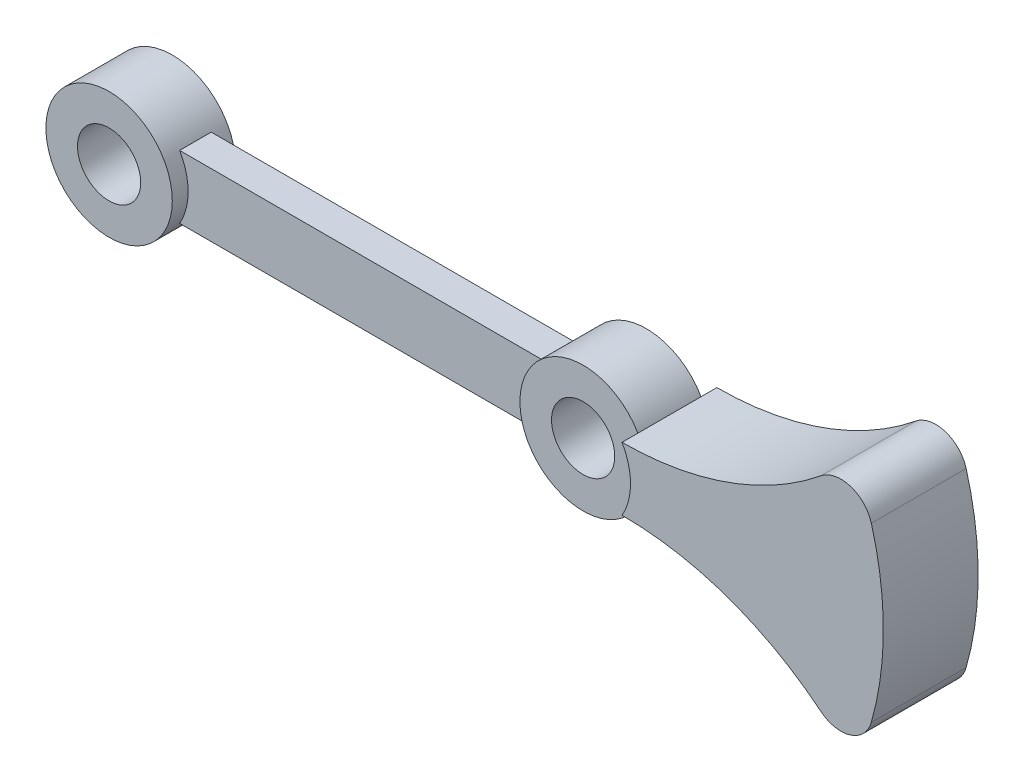
ISO-10303-21;
HEADER;
FILE_DESCRIPTION(('STEP AP214'),'2;1');
FILE_NAME('part.step','',(''),(''),'','','');
FILE_SCHEMA(('AUTOMOTIVE_DESIGN { 1 0 10303 214 1 1 1 1 }'));
ENDSEC;
DATA;
#1=APPLICATION_CONTEXT('core data for automotive mechanical design processes');
#2=APPLICATION_PROTOCOL_DEFINITION('international standard','automotive_design',2000,#1);
#3=PRODUCT_CONTEXT('',#1,'mechanical');
#4=PRODUCT('Part','Part','',(#3));
#5=PRODUCT_RELATED_PRODUCT_CATEGORY('part','',(#4));
#6=PRODUCT_DEFINITION_FORMATION('','',#4);
#7=PRODUCT_DEFINITION_CONTEXT('part definition',#1,'design');
#8=PRODUCT_DEFINITION('design','',#6,#7);
#9=PRODUCT_DEFINITION_SHAPE('','',#8);
#10=(LENGTH_UNIT() NAMED_UNIT(*) SI_UNIT(.MILLI.,.METRE.));
#11=(NAMED_UNIT(*) PLANE_ANGLE_UNIT() SI_UNIT($,.RADIAN.));
#12=(NAMED_UNIT(*) SI_UNIT($,.STERADIAN.) SOLID_ANGLE_UNIT());
#13=UNCERTAINTY_MEASURE_WITH_UNIT(LENGTH_MEASURE(1.E-05),#10,'distance_accuracy_value','');
#14=(GEOMETRIC_REPRESENTATION_CONTEXT(3) GLOBAL_UNCERTAINTY_ASSIGNED_CONTEXT((#13)) GLOBAL_UNIT_ASSIGNED_CONTEXT((#10,
#11,#12)) REPRESENTATION_CONTEXT('',''));
#15=CARTESIAN_POINT('',(0.,0.,0.));
#16=DIRECTION('',(0.,0.,1.));
#17=DIRECTION('',(1.,0.,0.));
#18=AXIS2_PLACEMENT_3D('',#15,#16,#17);
#19=CARTESIAN_POINT('',(45.,0.,-6.));
#20=DIRECTION('',(0.,0.,1.));
#21=DIRECTION('',(1.,0.,0.));
#22=AXIS2_PLACEMENT_3D('',#19,#20,#21);
#23=CYLINDRICAL_SURFACE('',#22,12.);
#24=DIRECTION('',(0.,0.,-1.));
#25=VECTOR('',#24,1.);
#26=CARTESIAN_POINT('',(34.6076951545867,6.,3.));
#27=LINE('',#26,#25);
#28=CARTESIAN_POINT('',(34.6076951545867,6.,3.));
#29=VERTEX_POINT('',#28);
#30=CARTESIAN_POINT('',(34.6076951545867,6.,-3.));
#31=VERTEX_POINT('',#30);
#32=EDGE_CURVE('E243',#29,#31,#27,.T.);
#33=ORIENTED_EDGE('',*,*,#32,.F.);
#34=CARTESIAN_POINT('',(45.,0.,3.));
#35=DIRECTION('',(0.,0.,-1.));
#36=DIRECTION('',(1.,0.,0.));
#37=AXIS2_PLACEMENT_3D('',#34,#35,#36);
#38=CIRCLE('',#37,12.);
#39=CARTESIAN_POINT('',(34.6076951545867,-6.,3.));
#40=VERTEX_POINT('',#39);
#41=EDGE_CURVE('E228',#40,#29,#38,.T.);
#42=ORIENTED_EDGE('',*,*,#41,.F.);
#43=DIRECTION('',(0.,0.,-1.));
#44=VECTOR('',#43,1.);
#45=CARTESIAN_POINT('',(34.6076951545867,-6.,3.));
#46=LINE('',#45,#44);
#47=CARTESIAN_POINT('',(34.6076951545867,-6.,-3.));
#48=VERTEX_POINT('',#47);
#49=EDGE_CURVE('E246',#40,#48,#46,.T.);
#50=ORIENTED_EDGE('',*,*,#49,.T.);
#51=CARTESIAN_POINT('',(45.,0.,-3.));
#52=DIRECTION('',(0.,0.,-1.));
#53=DIRECTION('',(1.,0.,0.));
#54=AXIS2_PLACEMENT_3D('',#51,#52,#53);
#55=CIRCLE('',#54,12.);
#56=EDGE_CURVE('E237',#48,#31,#55,.T.);
#57=ORIENTED_EDGE('',*,*,#56,.T.);
#58=EDGE_LOOP('',(#33,#42,#50,#57));
#59=FACE_BOUND('',#58,.T.);
#60=CARTESIAN_POINT('',(45.,0.,-6.));
#61=DIRECTION('',(0.,0.,1.));
#62=DIRECTION('',(1.,0.,0.));
#63=AXIS2_PLACEMENT_3D('',#60,#61,#62);
#64=CIRCLE('',#63,12.);
#65=CARTESIAN_POINT('',(55.3923048454132,6.00000000000001,-6.));
#66=VERTEX_POINT('',#65);
#67=CARTESIAN_POINT('',(55.3923048454132,-6.00000000000001,-6.));
#68=VERTEX_POINT('',#67);
#69=EDGE_CURVE('E217',#66,#68,#64,.T.);
#70=ORIENTED_EDGE('',*,*,#69,.T.);
#71=DIRECTION('',(0.,0.,-1.));
#72=VECTOR('',#71,1.);
#73=CARTESIAN_POINT('',(55.3923048454132,-6.00000000000001,9.));
#74=LINE('',#73,#72);
#75=CARTESIAN_POINT('',(55.3923048454132,-6.00000000000001,6.));
#76=VERTEX_POINT('',#75);
#77=EDGE_CURVE('E150',#76,#68,#74,.T.);
#78=ORIENTED_EDGE('',*,*,#77,.F.);
#79=CARTESIAN_POINT('',(45.,0.,6.));
#80=DIRECTION('',(0.,0.,1.));
#81=DIRECTION('',(1.,0.,0.));
#82=AXIS2_PLACEMENT_3D('',#79,#80,#81);
#83=CIRCLE('',#82,12.);
#84=CARTESIAN_POINT('',(55.3923048454133,6.00000000000001,6.));
#85=VERTEX_POINT('',#84);
#86=EDGE_CURVE('E214',#85,#76,#83,.T.);
#87=ORIENTED_EDGE('',*,*,#86,.F.);
#88=DIRECTION('',(0.,0.,-1.));
#89=VECTOR('',#88,1.);
#90=CARTESIAN_POINT('',(55.3923048454132,6.00000000000001,9.));
#91=LINE('',#90,#89);
#92=EDGE_CURVE('E170',#85,#66,#91,.T.);
#93=ORIENTED_EDGE('',*,*,#92,.T.);
#94=EDGE_LOOP('',(#70,#78,#87,#93));
#95=FACE_BOUND('',#94,.T.);
#96=ADVANCED_FACE('F37',(#59,#95),#23,.T.);
#97=CARTESIAN_POINT('',(-45.,0.,-6.));
#98=DIRECTION('',(0.,0.,1.));
#99=DIRECTION('',(1.,0.,0.));
#100=AXIS2_PLACEMENT_3D('',#97,#98,#99);
#101=CYLINDRICAL_SURFACE('',#100,12.);
#102=CARTESIAN_POINT('',(-45.,0.,3.));
#103=DIRECTION('',(0.,0.,-1.));
#104=DIRECTION('',(1.,0.,0.));
#105=AXIS2_PLACEMENT_3D('',#102,#103,#104);
#106=CIRCLE('',#105,12.);
#107=CARTESIAN_POINT('',(-34.6076951545867,6.,3.));
#108=VERTEX_POINT('',#107);
#109=CARTESIAN_POINT('',(-34.6076951545867,-6.,3.));
#110=VERTEX_POINT('',#109);
#111=EDGE_CURVE('E222',#108,#110,#106,.T.);
#112=ORIENTED_EDGE('',*,*,#111,.F.);
#113=DIRECTION('',(0.,0.,-1.));
#114=VECTOR('',#113,1.);
#115=CARTESIAN_POINT('',(-34.6076951545867,6.,3.));
#116=LINE('',#115,#114);
#117=CARTESIAN_POINT('',(-34.6076951545867,6.,-3.));
#118=VERTEX_POINT('',#117);
#119=EDGE_CURVE('E232',#108,#118,#116,.T.);
#120=ORIENTED_EDGE('',*,*,#119,.T.);
#121=CARTESIAN_POINT('',(-45.,0.,-3.));
#122=DIRECTION('',(0.,0.,-1.));
#123=DIRECTION('',(1.,0.,0.));
#124=AXIS2_PLACEMENT_3D('',#121,#122,#123);
#125=CIRCLE('',#124,12.);
#126=CARTESIAN_POINT('',(-34.6076951545867,-6.,-3.));
#127=VERTEX_POINT('',#126);
#128=EDGE_CURVE('E218',#118,#127,#125,.T.);
#129=ORIENTED_EDGE('',*,*,#128,.T.);
#130=DIRECTION('',(0.,0.,-1.));
#131=VECTOR('',#130,1.);
#132=CARTESIAN_POINT('',(-34.6076951545867,-6.,3.));
#133=LINE('',#132,#131);
#134=EDGE_CURVE('E60',#110,#127,#133,.T.);
#135=ORIENTED_EDGE('',*,*,#134,.F.);
#136=EDGE_LOOP('',(#112,#120,#129,#135));
#137=FACE_BOUND('',#136,.T.);
#138=CARTESIAN_POINT('',(-45.,0.,-6.));
#139=DIRECTION('',(0.,0.,1.));
#140=DIRECTION('',(1.,0.,0.));
#141=AXIS2_PLACEMENT_3D('',#138,#139,#140);
#142=CIRCLE('',#141,12.);
#143=CARTESIAN_POINT('',(-33.,0.,-6.));
#144=VERTEX_POINT('',#143);
#145=EDGE_CURVE('E11',#144,#144,#142,.T.);
#146=ORIENTED_EDGE('',*,*,#145,.T.);
#147=EDGE_LOOP('',(#146));
#148=FACE_BOUND('',#147,.T.);
#149=CARTESIAN_POINT('',(-45.,0.,6.));
#150=DIRECTION('',(0.,0.,1.));
#151=DIRECTION('',(1.,0.,0.));
#152=AXIS2_PLACEMENT_3D('',#149,#150,#151);
#153=CIRCLE('',#152,12.);
#154=CARTESIAN_POINT('',(-33.,0.,6.));
#155=VERTEX_POINT('',#154);
#156=EDGE_CURVE('E41',#155,#155,#153,.T.);
#157=ORIENTED_EDGE('',*,*,#156,.F.);
#158=EDGE_LOOP('',(#157));
#159=FACE_BOUND('',#158,.T.);
#160=ADVANCED_FACE('F39',(#137,#148,#159),#101,.T.);
#161=CARTESIAN_POINT('',(-45.,0.,-6.));
#162=DIRECTION('',(0.,0.,1.));
#163=DIRECTION('',(1.,0.,0.));
#164=AXIS2_PLACEMENT_3D('',#161,#162,#163);
#165=PLANE('',#164);
#166=CARTESIAN_POINT('',(-45.,0.,-6.));
#167=DIRECTION('',(0.,0.,1.));
#168=DIRECTION('',(1.,0.,0.));
#169=AXIS2_PLACEMENT_3D('',#166,#167,#168);
#170=CIRCLE('',#169,6.);
#171=CARTESIAN_POINT('',(-39.,0.,-6.));
#172=VERTEX_POINT('',#171);
#173=EDGE_CURVE('E251',#172,#172,#170,.T.);
#174=ORIENTED_EDGE('',*,*,#173,.T.);
#175=EDGE_LOOP('',(#174));
#176=FACE_BOUND('',#175,.T.);
#177=ORIENTED_EDGE('',*,*,#145,.F.);
#178=EDGE_LOOP('',(#177));
#179=FACE_BOUND('',#178,.T.);
#180=ADVANCED_FACE('F262',(#176,#179),#165,.F.);
#181=CARTESIAN_POINT('',(-45.,0.,6.));
#182=DIRECTION('',(0.,0.,1.));
#183=DIRECTION('',(1.,0.,0.));
#184=AXIS2_PLACEMENT_3D('',#181,#182,#183);
#185=PLANE('',#184);
#186=CARTESIAN_POINT('',(-45.,0.,6.));
#187=DIRECTION('',(0.,0.,1.));
#188=DIRECTION('',(1.,0.,0.));
#189=AXIS2_PLACEMENT_3D('',#186,#187,#188);
#190=CIRCLE('',#189,6.);
#191=CARTESIAN_POINT('',(-39.,0.,6.));
#192=VERTEX_POINT('',#191);
#193=EDGE_CURVE('E250',#192,#192,#190,.T.);
#194=ORIENTED_EDGE('',*,*,#193,.F.);
#195=EDGE_LOOP('',(#194));
#196=FACE_BOUND('',#195,.T.);
#197=ORIENTED_EDGE('',*,*,#156,.T.);
#198=EDGE_LOOP('',(#197));
#199=FACE_BOUND('',#198,.T.);
#200=ADVANCED_FACE('F259',(#196,#199),#185,.T.);
#201=CARTESIAN_POINT('',(-45.,0.,-6.));
#202=DIRECTION('',(0.,0.,1.));
#203=DIRECTION('',(1.,0.,0.));
#204=AXIS2_PLACEMENT_3D('',#201,#202,#203);
#205=CYLINDRICAL_SURFACE('',#204,6.);
#206=ORIENTED_EDGE('',*,*,#173,.F.);
#207=EDGE_LOOP('',(#206));
#208=FACE_BOUND('',#207,.T.);
#209=ORIENTED_EDGE('',*,*,#193,.T.);
#210=EDGE_LOOP('',(#209));
#211=FACE_BOUND('',#210,.T.);
#212=ADVANCED_FACE('F257',(#208,#211),#205,.F.);
#213=CARTESIAN_POINT('',(-34.6076951545867,-6.,3.));
#214=DIRECTION('',(0.,1.,0.));
#215=DIRECTION('',(0.,0.,1.));
#216=AXIS2_PLACEMENT_3D('',#213,#214,#215);
#217=PLANE('',#216);
#218=DIRECTION('',(1.,0.,0.));
#219=VECTOR('',#218,1.);
#220=CARTESIAN_POINT('',(-34.6076951545867,-6.,-3.));
#221=LINE('',#220,#219);
#222=EDGE_CURVE('E235',#127,#48,#221,.T.);
#223=ORIENTED_EDGE('',*,*,#222,.T.);
#224=ORIENTED_EDGE('',*,*,#49,.F.);
#225=DIRECTION('',(1.,0.,0.));
#226=VECTOR('',#225,1.);
#227=CARTESIAN_POINT('',(-34.6076951545867,-6.,3.));
#228=LINE('',#227,#226);
#229=EDGE_CURVE('E225',#110,#40,#228,.T.);
#230=ORIENTED_EDGE('',*,*,#229,.F.);
#231=ORIENTED_EDGE('',*,*,#134,.T.);
#232=EDGE_LOOP('',(#223,#224,#230,#231));
#233=FACE_BOUND('',#232,.T.);
#234=ADVANCED_FACE('F293',(#233),#217,.F.);
#235=CARTESIAN_POINT('',(-34.6076951545867,6.,3.));
#236=DIRECTION('',(0.,-1.,0.));
#237=DIRECTION('',(0.,0.,-1.));
#238=AXIS2_PLACEMENT_3D('',#235,#236,#237);
#239=PLANE('',#238);
#240=DIRECTION('',(-1.,0.,0.));
#241=VECTOR('',#240,1.);
#242=CARTESIAN_POINT('',(-34.6076951545867,6.,-3.));
#243=LINE('',#242,#241);
#244=EDGE_CURVE('E226',#31,#118,#243,.T.);
#245=ORIENTED_EDGE('',*,*,#244,.T.);
#246=ORIENTED_EDGE('',*,*,#119,.F.);
#247=DIRECTION('',(-1.,0.,0.));
#248=VECTOR('',#247,1.);
#249=CARTESIAN_POINT('',(-34.6076951545867,6.,3.));
#250=LINE('',#249,#248);
#251=EDGE_CURVE('E230',#29,#108,#250,.T.);
#252=ORIENTED_EDGE('',*,*,#251,.F.);
#253=ORIENTED_EDGE('',*,*,#32,.T.);
#254=EDGE_LOOP('',(#245,#246,#252,#253));
#255=FACE_BOUND('',#254,.T.);
#256=ADVANCED_FACE('F288',(#255),#239,.F.);
#257=CARTESIAN_POINT('',(-45.,0.,3.));
#258=DIRECTION('',(0.,0.,1.));
#259=DIRECTION('',(1.,0.,0.));
#260=AXIS2_PLACEMENT_3D('',#257,#258,#259);
#261=PLANE('',#260);
#262=ORIENTED_EDGE('',*,*,#111,.T.);
#263=ORIENTED_EDGE('',*,*,#229,.T.);
#264=ORIENTED_EDGE('',*,*,#41,.T.);
#265=ORIENTED_EDGE('',*,*,#251,.T.);
#266=EDGE_LOOP('',(#262,#263,#264,#265));
#267=FACE_BOUND('',#266,.T.);
#268=ADVANCED_FACE('F282',(#267),#261,.T.);
#269=CARTESIAN_POINT('',(-45.,0.,-3.));
#270=DIRECTION('',(0.,0.,1.));
#271=DIRECTION('',(1.,0.,0.));
#272=AXIS2_PLACEMENT_3D('',#269,#270,#271);
#273=PLANE('',#272);
#274=ORIENTED_EDGE('',*,*,#128,.F.);
#275=ORIENTED_EDGE('',*,*,#244,.F.);
#276=ORIENTED_EDGE('',*,*,#56,.F.);
#277=ORIENTED_EDGE('',*,*,#222,.F.);
#278=EDGE_LOOP('',(#274,#275,#276,#277));
#279=FACE_BOUND('',#278,.T.);
#280=ADVANCED_FACE('F292',(#279),#273,.F.);
#281=CARTESIAN_POINT('',(45.,0.,-6.));
#282=DIRECTION('',(0.,0.,1.));
#283=DIRECTION('',(1.,0.,0.));
#284=AXIS2_PLACEMENT_3D('',#281,#282,#283);
#285=PLANE('',#284);
#286=CARTESIAN_POINT('',(45.,0.,-6.));
#287=DIRECTION('',(0.,0.,1.));
#288=DIRECTION('',(1.,0.,0.));
#289=AXIS2_PLACEMENT_3D('',#286,#287,#288);
#290=CIRCLE('',#289,6.);
#291=CARTESIAN_POINT('',(51.,0.,-6.));
#292=VERTEX_POINT('',#291);
#293=EDGE_CURVE('E215',#292,#292,#290,.T.);
#294=ORIENTED_EDGE('',*,*,#293,.T.);
#295=EDGE_LOOP('',(#294));
#296=FACE_BOUND('',#295,.T.);
#297=ORIENTED_EDGE('',*,*,#69,.F.);
#298=CARTESIAN_POINT('',(45.,0.,-6.));
#299=DIRECTION('',(0.,0.,1.));
#300=DIRECTION('',(1.,0.,0.));
#301=AXIS2_PLACEMENT_3D('',#298,#299,#300);
#302=CIRCLE('',#301,12.);
#303=EDGE_CURVE('E149',#68,#66,#302,.T.);
#304=ORIENTED_EDGE('',*,*,#303,.F.);
#305=EDGE_LOOP('',(#297,#304));
#306=FACE_BOUND('',#305,.T.);
#307=ADVANCED_FACE('F306',(#296,#306),#285,.F.);
#308=CARTESIAN_POINT('',(45.,0.,6.));
#309=DIRECTION('',(0.,0.,1.));
#310=DIRECTION('',(1.,0.,0.));
#311=AXIS2_PLACEMENT_3D('',#308,#309,#310);
#312=PLANE('',#311);
#313=CARTESIAN_POINT('',(45.,0.,6.));
#314=DIRECTION('',(0.,0.,1.));
#315=DIRECTION('',(1.,0.,0.));
#316=AXIS2_PLACEMENT_3D('',#313,#314,#315);
#317=CIRCLE('',#316,6.);
#318=CARTESIAN_POINT('',(51.,0.,6.));
#319=VERTEX_POINT('',#318);
#320=EDGE_CURVE('E153',#319,#319,#317,.T.);
#321=ORIENTED_EDGE('',*,*,#320,.F.);
#322=EDGE_LOOP('',(#321));
#323=FACE_BOUND('',#322,.T.);
#324=ORIENTED_EDGE('',*,*,#86,.T.);
#325=EDGE_CURVE('E148',#76,#85,#83,.T.);
#326=ORIENTED_EDGE('',*,*,#325,.T.);
#327=EDGE_LOOP('',(#324,#326));
#328=FACE_BOUND('',#327,.T.);
#329=ADVANCED_FACE('F213',(#323,#328),#312,.T.);
#330=CARTESIAN_POINT('',(45.,0.,-6.));
#331=DIRECTION('',(0.,0.,1.));
#332=DIRECTION('',(1.,0.,0.));
#333=AXIS2_PLACEMENT_3D('',#330,#331,#332);
#334=CYLINDRICAL_SURFACE('',#333,6.);
#335=ORIENTED_EDGE('',*,*,#293,.F.);
#336=EDGE_LOOP('',(#335));
#337=FACE_BOUND('',#336,.T.);
#338=ORIENTED_EDGE('',*,*,#320,.T.);
#339=EDGE_LOOP('',(#338));
#340=FACE_BOUND('',#339,.T.);
#341=ADVANCED_FACE('F311',(#337,#340),#334,.F.);
#342=CARTESIAN_POINT('',(45.,0.,9.));
#343=DIRECTION('',(0.,0.,-1.));
#344=DIRECTION('',(-1.,0.,0.));
#345=AXIS2_PLACEMENT_3D('',#342,#343,#344);
#346=CYLINDRICAL_SURFACE('',#345,12.);
#347=CARTESIAN_POINT('',(55.3923048454132,-6.00000000000001,-9.));
#348=VERTEX_POINT('',#347);
#349=EDGE_CURVE('E152',#68,#348,#74,.T.);
#350=ORIENTED_EDGE('',*,*,#349,.F.);
#351=ORIENTED_EDGE('',*,*,#303,.T.);
#352=CARTESIAN_POINT('',(55.3923048454132,6.00000000000001,-9.));
#353=VERTEX_POINT('',#352);
#354=EDGE_CURVE('E171',#66,#353,#91,.T.);
#355=ORIENTED_EDGE('',*,*,#354,.T.);
#356=CARTESIAN_POINT('',(45.,0.,-9.));
#357=DIRECTION('',(0.,0.,-1.));
#358=DIRECTION('',(1.,0.,0.));
#359=AXIS2_PLACEMENT_3D('',#356,#357,#358);
#360=CIRCLE('',#359,12.);
#361=EDGE_CURVE('E182',#353,#348,#360,.T.);
#362=ORIENTED_EDGE('',*,*,#361,.T.);
#363=EDGE_LOOP('',(#350,#351,#355,#362));
#364=FACE_BOUND('',#363,.T.);
#365=ADVANCED_FACE('F318',(#364),#346,.F.);
#366=ORIENTED_EDGE('',*,*,#325,.F.);
#367=CARTESIAN_POINT('',(55.3923048454132,-6.00000000000001,9.));
#368=VERTEX_POINT('',#367);
#369=EDGE_CURVE('E132',#368,#76,#74,.T.);
#370=ORIENTED_EDGE('',*,*,#369,.F.);
#371=CARTESIAN_POINT('',(45.,0.,9.));
#372=DIRECTION('',(0.,0.,-1.));
#373=DIRECTION('',(1.,0.,0.));
#374=AXIS2_PLACEMENT_3D('',#371,#372,#373);
#375=CIRCLE('',#374,12.);
#376=CARTESIAN_POINT('',(55.3923048454132,6.00000000000001,9.));
#377=VERTEX_POINT('',#376);
#378=EDGE_CURVE('E139',#377,#368,#375,.T.);
#379=ORIENTED_EDGE('',*,*,#378,.F.);
#380=EDGE_CURVE('E52',#377,#85,#91,.T.);
#381=ORIENTED_EDGE('',*,*,#380,.T.);
#382=EDGE_LOOP('',(#366,#370,#379,#381));
#383=FACE_BOUND('',#382,.T.);
#384=ADVANCED_FACE('F146',(#383),#346,.F.);
#385=CARTESIAN_POINT('',(55.3923048454133,-66.,9.));
#386=DIRECTION('',(0.,0.,-1.));
#387=DIRECTION('',(-1.,0.,0.));
#388=AXIS2_PLACEMENT_3D('',#385,#386,#387);
#389=CYLINDRICAL_SURFACE('',#388,60.);
#390=CARTESIAN_POINT('',(55.3923048454133,-66.,-9.));
#391=DIRECTION('',(0.,0.,-1.));
#392=DIRECTION('',(-1.,0.,0.));
#393=AXIS2_PLACEMENT_3D('',#390,#391,#392);
#394=CIRCLE('',#393,60.);
#395=CARTESIAN_POINT('',(93.1743309038072,-19.3897167255676,-9.));
#396=VERTEX_POINT('',#395);
#397=EDGE_CURVE('E180',#348,#396,#394,.T.);
#398=ORIENTED_EDGE('',*,*,#397,.T.);
#399=DIRECTION('',(0.,0.,-1.));
#400=VECTOR('',#399,1.);
#401=CARTESIAN_POINT('',(93.1743309038072,-19.3897167255676,9.));
#402=LINE('',#401,#400);
#403=CARTESIAN_POINT('',(93.1743309038072,-19.3897167255676,9.));
#404=VERTEX_POINT('',#403);
#405=EDGE_CURVE('E135',#404,#396,#402,.T.);
#406=ORIENTED_EDGE('',*,*,#405,.F.);
#407=CARTESIAN_POINT('',(55.3923048454133,-66.,9.));
#408=DIRECTION('',(0.,0.,-1.));
#409=DIRECTION('',(-1.,0.,0.));
#410=AXIS2_PLACEMENT_3D('',#407,#408,#409);
#411=CIRCLE('',#410,60.);
#412=EDGE_CURVE('E127',#368,#404,#411,.T.);
#413=ORIENTED_EDGE('',*,*,#412,.F.);
#414=ORIENTED_EDGE('',*,*,#369,.T.);
#415=ORIENTED_EDGE('',*,*,#77,.T.);
#416=ORIENTED_EDGE('',*,*,#349,.T.);
#417=EDGE_LOOP('',(#398,#406,#413,#414,#415,#416));
#418=FACE_BOUND('',#417,.T.);
#419=ADVANCED_FACE('F129',(#418),#389,.F.);
#420=CARTESIAN_POINT('',(96.9525335096466,-14.7286883981243,9.));
#421=DIRECTION('',(0.,0.,-1.));
#422=DIRECTION('',(-1.,0.,0.));
#423=AXIS2_PLACEMENT_3D('',#420,#421,#422);
#424=CYLINDRICAL_SURFACE('',#423,6.00000000000001);
#425=CARTESIAN_POINT('',(96.9525335096466,-14.7286883981243,-9.));
#426=DIRECTION('',(0.,0.,1.));
#427=DIRECTION('',(-1.,0.,0.));
#428=AXIS2_PLACEMENT_3D('',#425,#426,#427);
#429=CIRCLE('',#428,6.00000000000001);
#430=CARTESIAN_POINT('',(102.725037232941,-16.3652093312492,-9.));
#431=VERTEX_POINT('',#430);
#432=EDGE_CURVE('E178',#396,#431,#429,.T.);
#433=ORIENTED_EDGE('',*,*,#432,.T.);
#434=DIRECTION('',(0.,0.,-1.));
#435=VECTOR('',#434,1.);
#436=CARTESIAN_POINT('',(102.725037232941,-16.3652093312492,9.));
#437=LINE('',#436,#435);
#438=CARTESIAN_POINT('',(102.725037232941,-16.3652093312492,9.));
#439=VERTEX_POINT('',#438);
#440=EDGE_CURVE('E157',#439,#431,#437,.T.);
#441=ORIENTED_EDGE('',*,*,#440,.F.);
#442=CARTESIAN_POINT('',(96.9525335096466,-14.7286883981243,9.));
#443=DIRECTION('',(0.,0.,1.));
#444=DIRECTION('',(-1.,0.,0.));
#445=AXIS2_PLACEMENT_3D('',#442,#443,#444);
#446=CIRCLE('',#445,6.00000000000001);
#447=EDGE_CURVE('E138',#404,#439,#446,.T.);
#448=ORIENTED_EDGE('',*,*,#447,.F.);
#449=ORIENTED_EDGE('',*,*,#405,.T.);
#450=EDGE_LOOP('',(#433,#441,#448,#449));
#451=FACE_BOUND('',#450,.T.);
#452=ADVANCED_FACE('F193',(#451),#424,.T.);
#453=CARTESIAN_POINT('',(45.,0.,9.));
#454=DIRECTION('',(0.,0.,-1.));
#455=DIRECTION('',(-1.,0.,0.));
#456=AXIS2_PLACEMENT_3D('',#453,#454,#455);
#457=CYLINDRICAL_SURFACE('',#456,60.);
#458=CARTESIAN_POINT('',(45.,0.,-9.));
#459=DIRECTION('',(0.,0.,1.));
#460=DIRECTION('',(-1.,0.,0.));
#461=AXIS2_PLACEMENT_3D('',#458,#459,#460);
#462=CIRCLE('',#461,60.);
#463=CARTESIAN_POINT('',(102.725037232941,16.3652093312492,-9.));
#464=VERTEX_POINT('',#463);
#465=EDGE_CURVE('E176',#431,#464,#462,.T.);
#466=ORIENTED_EDGE('',*,*,#465,.T.);
#467=DIRECTION('',(0.,0.,-1.));
#468=VECTOR('',#467,1.);
#469=CARTESIAN_POINT('',(102.725037232941,16.3652093312492,9.));
#470=LINE('',#469,#468);
#471=CARTESIAN_POINT('',(102.725037232941,16.3652093312492,9.));
#472=VERTEX_POINT('',#471);
#473=EDGE_CURVE('E161',#472,#464,#470,.T.);
#474=ORIENTED_EDGE('',*,*,#473,.F.);
#475=CARTESIAN_POINT('',(45.,0.,9.));
#476=DIRECTION('',(0.,0.,1.));
#477=DIRECTION('',(-1.,0.,0.));
#478=AXIS2_PLACEMENT_3D('',#475,#476,#477);
#479=CIRCLE('',#478,60.);
#480=EDGE_CURVE('E188',#439,#472,#479,.T.);
#481=ORIENTED_EDGE('',*,*,#480,.F.);
#482=ORIENTED_EDGE('',*,*,#440,.T.);
#483=EDGE_LOOP('',(#466,#474,#481,#482));
#484=FACE_BOUND('',#483,.T.);
#485=ADVANCED_FACE('F196',(#484),#457,.T.);
#486=CARTESIAN_POINT('',(96.9525335096466,14.7286883981243,9.));
#487=DIRECTION('',(0.,0.,-1.));
#488=DIRECTION('',(-1.,0.,0.));
#489=AXIS2_PLACEMENT_3D('',#486,#487,#488);
#490=CYLINDRICAL_SURFACE('',#489,6.00000000000001);
#491=CARTESIAN_POINT('',(96.9525335096466,14.7286883981243,-9.));
#492=DIRECTION('',(0.,0.,1.));
#493=DIRECTION('',(-1.,0.,0.));
#494=AXIS2_PLACEMENT_3D('',#491,#492,#493);
#495=CIRCLE('',#494,6.00000000000001);
#496=CARTESIAN_POINT('',(93.1743309038072,19.3897167255676,-9.));
#497=VERTEX_POINT('',#496);
#498=EDGE_CURVE('E174',#464,#497,#495,.T.);
#499=ORIENTED_EDGE('',*,*,#498,.T.);
#500=DIRECTION('',(0.,0.,-1.));
#501=VECTOR('',#500,1.);
#502=CARTESIAN_POINT('',(93.1743309038072,19.3897167255676,9.));
#503=LINE('',#502,#501);
#504=CARTESIAN_POINT('',(93.1743309038072,19.3897167255676,9.));
#505=VERTEX_POINT('',#504);
#506=EDGE_CURVE('E166',#505,#497,#503,.T.);
#507=ORIENTED_EDGE('',*,*,#506,.F.);
#508=CARTESIAN_POINT('',(96.9525335096466,14.7286883981243,9.));
#509=DIRECTION('',(0.,0.,1.));
#510=DIRECTION('',(-1.,0.,0.));
#511=AXIS2_PLACEMENT_3D('',#508,#509,#510);
#512=CIRCLE('',#511,6.00000000000001);
#513=EDGE_CURVE('E186',#472,#505,#512,.T.);
#514=ORIENTED_EDGE('',*,*,#513,.F.);
#515=ORIENTED_EDGE('',*,*,#473,.T.);
#516=EDGE_LOOP('',(#499,#507,#514,#515));
#517=FACE_BOUND('',#516,.T.);
#518=ADVANCED_FACE('F201',(#517),#490,.T.);
#519=CARTESIAN_POINT('',(55.3923048454133,66.,9.));
#520=DIRECTION('',(0.,0.,-1.));
#521=DIRECTION('',(-1.,0.,0.));
#522=AXIS2_PLACEMENT_3D('',#519,#520,#521);
#523=CYLINDRICAL_SURFACE('',#522,60.);
#524=CARTESIAN_POINT('',(55.3923048454133,66.,-9.));
#525=DIRECTION('',(0.,0.,-1.));
#526=DIRECTION('',(1.,0.,0.));
#527=AXIS2_PLACEMENT_3D('',#524,#525,#526);
#528=CIRCLE('',#527,60.);
#529=EDGE_CURVE('E144',#497,#353,#528,.T.);
#530=ORIENTED_EDGE('',*,*,#529,.T.);
#531=ORIENTED_EDGE('',*,*,#354,.F.);
#532=ORIENTED_EDGE('',*,*,#92,.F.);
#533=ORIENTED_EDGE('',*,*,#380,.F.);
#534=CARTESIAN_POINT('',(55.3923048454133,66.,9.));
#535=DIRECTION('',(0.,0.,-1.));
#536=DIRECTION('',(1.,0.,0.));
#537=AXIS2_PLACEMENT_3D('',#534,#535,#536);
#538=CIRCLE('',#537,60.);
#539=EDGE_CURVE('E143',#505,#377,#538,.T.);
#540=ORIENTED_EDGE('',*,*,#539,.F.);
#541=ORIENTED_EDGE('',*,*,#506,.T.);
#542=EDGE_LOOP('',(#530,#531,#532,#533,#540,#541));
#543=FACE_BOUND('',#542,.T.);
#544=ADVANCED_FACE('F204',(#543),#523,.F.);
#545=CARTESIAN_POINT('',(50.1961524227066,33.,9.));
#546=DIRECTION('',(0.,0.,1.));
#547=DIRECTION('',(1.,0.,0.));
#548=AXIS2_PLACEMENT_3D('',#545,#546,#547);
#549=PLANE('',#548);
#550=ORIENTED_EDGE('',*,*,#378,.T.);
#551=ORIENTED_EDGE('',*,*,#412,.T.);
#552=ORIENTED_EDGE('',*,*,#447,.T.);
#553=ORIENTED_EDGE('',*,*,#480,.T.);
#554=ORIENTED_EDGE('',*,*,#513,.T.);
#555=ORIENTED_EDGE('',*,*,#539,.T.);
#556=EDGE_LOOP('',(#550,#551,#552,#553,#554,#555));
#557=FACE_BOUND('',#556,.T.);
#558=ADVANCED_FACE('F141',(#557),#549,.T.);
#559=CARTESIAN_POINT('',(50.1961524227066,33.,-9.));
#560=DIRECTION('',(0.,0.,1.));
#561=DIRECTION('',(1.,0.,0.));
#562=AXIS2_PLACEMENT_3D('',#559,#560,#561);
#563=PLANE('',#562);
#564=ORIENTED_EDGE('',*,*,#361,.F.);
#565=ORIENTED_EDGE('',*,*,#529,.F.);
#566=ORIENTED_EDGE('',*,*,#498,.F.);
#567=ORIENTED_EDGE('',*,*,#465,.F.);
#568=ORIENTED_EDGE('',*,*,#432,.F.);
#569=ORIENTED_EDGE('',*,*,#397,.F.);
#570=EDGE_LOOP('',(#564,#565,#566,#567,#568,#569));
#571=FACE_BOUND('',#570,.T.);
#572=ADVANCED_FACE('F332',(#571),#563,.F.);
#573=CLOSED_SHELL('',(#96,#160,#180,#200,#212,#234,#256,#268,#280,#307,#329,#341,#365,#384,#419,
#452,#485,#518,#544,#558,#572));
#574=MANIFOLD_SOLID_BREP('B2',#573);
#575=ADVANCED_BREP_SHAPE_REPRESENTATION('',(#18,#574),#14);
#576=SHAPE_DEFINITION_REPRESENTATION(#9,#575);
ENDSEC;
END-ISO-10303-21;
